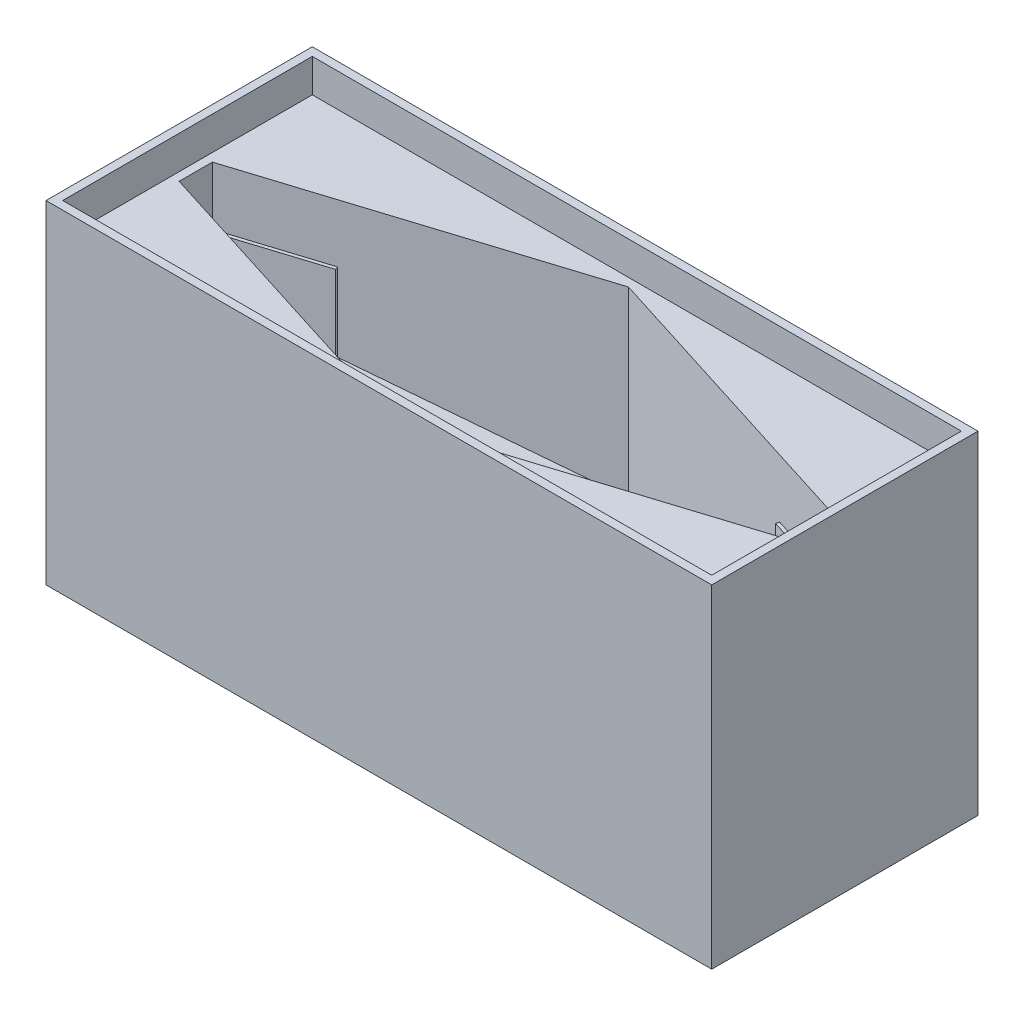
ISO-10303-21;
HEADER;
FILE_DESCRIPTION(('STEP AP214'),'2;1');
FILE_NAME('part.step','',(''),(''),'','','');
FILE_SCHEMA(('AUTOMOTIVE_DESIGN { 1 0 10303 214 1 1 1 1 }'));
ENDSEC;
DATA;
#1=APPLICATION_CONTEXT('core data for automotive mechanical design processes');
#2=APPLICATION_PROTOCOL_DEFINITION('international standard','automotive_design',2000,#1);
#3=PRODUCT_CONTEXT('',#1,'mechanical');
#4=PRODUCT('Part','Part','',(#3));
#5=PRODUCT_RELATED_PRODUCT_CATEGORY('part','',(#4));
#6=PRODUCT_DEFINITION_FORMATION('','',#4);
#7=PRODUCT_DEFINITION_CONTEXT('part definition',#1,'design');
#8=PRODUCT_DEFINITION('design','',#6,#7);
#9=PRODUCT_DEFINITION_SHAPE('','',#8);
#10=(LENGTH_UNIT() NAMED_UNIT(*) SI_UNIT(.MILLI.,.METRE.));
#11=(NAMED_UNIT(*) PLANE_ANGLE_UNIT() SI_UNIT($,.RADIAN.));
#12=(NAMED_UNIT(*) SI_UNIT($,.STERADIAN.) SOLID_ANGLE_UNIT());
#13=UNCERTAINTY_MEASURE_WITH_UNIT(LENGTH_MEASURE(1.E-05),#10,'distance_accuracy_value','');
#14=(GEOMETRIC_REPRESENTATION_CONTEXT(3) GLOBAL_UNCERTAINTY_ASSIGNED_CONTEXT((#13)) GLOBAL_UNIT_ASSIGNED_CONTEXT((#10,
#11,#12)) REPRESENTATION_CONTEXT('',''));
#15=CARTESIAN_POINT('',(0.,0.,0.));
#16=DIRECTION('',(0.,0.,1.));
#17=DIRECTION('',(1.,0.,0.));
#18=AXIS2_PLACEMENT_3D('',#15,#16,#17);
#19=CARTESIAN_POINT('',(0.,7.,3.5));
#20=DIRECTION('',(0.301131367937097,0.,0.953582665134142));
#21=DIRECTION('',(0.953582665134142,0.,-0.301131367937097));
#22=AXIS2_PLACEMENT_3D('',#19,#20,#21);
#23=PLANE('',#22);
#24=DIRECTION('',(0.,1.,0.));
#25=VECTOR('',#24,1.);
#26=CARTESIAN_POINT('',(6.63925200459757,7.25,1.40339410381129));
#27=LINE('',#26,#25);
#28=CARTESIAN_POINT('',(6.63925200459757,4.89773726412581,1.40339410381129));
#29=VERTEX_POINT('',#28);
#30=CARTESIAN_POINT('',(6.63925200459757,7.25,1.40339410381129));
#31=VERTEX_POINT('',#30);
#32=EDGE_CURVE('E879',#29,#31,#27,.T.);
#33=ORIENTED_EDGE('',*,*,#32,.F.);
#34=DIRECTION('',(0.934928879479734,0.196827132522049,-0.295240698783074));
#35=VECTOR('',#34,1.);
#36=CARTESIAN_POINT('',(-5.14285759581207,2.41729313772378,5.12406029341434));
#37=LINE('',#36,#35);
#38=CARTESIAN_POINT('',(0.,3.5,3.5));
#39=VERTEX_POINT('',#38);
#40=EDGE_CURVE('E375',#39,#29,#37,.T.);
#41=ORIENTED_EDGE('',*,*,#40,.F.);
#42=DIRECTION('',(0.,1.,0.));
#43=VECTOR('',#42,1.);
#44=CARTESIAN_POINT('',(0.,7.,3.5));
#45=LINE('',#44,#43);
#46=CARTESIAN_POINT('',(0.,9.,3.5));
#47=VERTEX_POINT('',#46);
#48=EDGE_CURVE('E411',#39,#47,#45,.T.);
#49=ORIENTED_EDGE('',*,*,#48,.T.);
#50=DIRECTION('',(0.953582665134142,0.,-0.301131367937097));
#51=VECTOR('',#50,1.);
#52=CARTESIAN_POINT('',(0.,9.,3.5));
#53=LINE('',#52,#51);
#54=CARTESIAN_POINT('',(9.5,9.,0.5));
#55=VERTEX_POINT('',#54);
#56=EDGE_CURVE('E363',#47,#55,#53,.T.);
#57=ORIENTED_EDGE('',*,*,#56,.T.);
#58=DIRECTION('',(0.,1.,0.));
#59=VECTOR('',#58,1.);
#60=CARTESIAN_POINT('',(9.5,7.,0.5));
#61=LINE('',#60,#59);
#62=CARTESIAN_POINT('',(9.5,7.25,0.5));
#63=VERTEX_POINT('',#62);
#64=EDGE_CURVE('E410',#63,#55,#61,.T.);
#65=ORIENTED_EDGE('',*,*,#64,.F.);
#66=DIRECTION('',(0.953582665134141,0.,-0.301131367937098));
#67=VECTOR('',#66,1.);
#68=CARTESIAN_POINT('',(9.49999999999999,7.25,0.499999999999996));
#69=LINE('',#68,#67);
#70=EDGE_CURVE('E240',#31,#63,#69,.T.);
#71=ORIENTED_EDGE('',*,*,#70,.F.);
#72=EDGE_LOOP('',(#33,#41,#49,#57,#65,#71));
#73=FACE_BOUND('',#72,.T.);
#74=ADVANCED_FACE('F36',(#73),#23,.F.);
#75=CARTESIAN_POINT('',(0.,7.,-3.5));
#76=DIRECTION('',(-0.301131367937098,0.,-0.953582665134142));
#77=DIRECTION('',(-0.953582665134142,0.,0.301131367937098));
#78=AXIS2_PLACEMENT_3D('',#75,#76,#77);
#79=PLANE('',#78);
#80=DIRECTION('',(0.,1.,0.));
#81=VECTOR('',#80,1.);
#82=CARTESIAN_POINT('',(-6.63925200459757,7.25,-1.40339410381129));
#83=LINE('',#82,#81);
#84=CARTESIAN_POINT('',(-6.63925200459757,4.89773726412581,-1.40339410381129));
#85=VERTEX_POINT('',#84);
#86=CARTESIAN_POINT('',(-6.63925200459757,7.25,-1.40339410381129));
#87=VERTEX_POINT('',#86);
#88=EDGE_CURVE('E304',#85,#87,#83,.T.);
#89=ORIENTED_EDGE('',*,*,#88,.F.);
#90=DIRECTION('',(0.934928879479733,-0.196827132522049,-0.295240698783074));
#91=VECTOR('',#90,1.);
#92=CARTESIAN_POINT('',(5.14285759581207,2.41729313772377,-5.12406029341434));
#93=LINE('',#92,#91);
#94=CARTESIAN_POINT('',(0.,3.5,-3.5));
#95=VERTEX_POINT('',#94);
#96=EDGE_CURVE('E393',#85,#95,#93,.T.);
#97=ORIENTED_EDGE('',*,*,#96,.T.);
#98=DIRECTION('',(0.,1.,0.));
#99=VECTOR('',#98,1.);
#100=CARTESIAN_POINT('',(0.,7.,-3.5));
#101=LINE('',#100,#99);
#102=CARTESIAN_POINT('',(0.,9.,-3.5));
#103=VERTEX_POINT('',#102);
#104=EDGE_CURVE('E399',#95,#103,#101,.T.);
#105=ORIENTED_EDGE('',*,*,#104,.T.);
#106=DIRECTION('',(-0.953582665134142,0.,0.301131367937098));
#107=VECTOR('',#106,1.);
#108=CARTESIAN_POINT('',(0.,9.,-3.5));
#109=LINE('',#108,#107);
#110=CARTESIAN_POINT('',(-9.5,9.,-0.499999999999999));
#111=VERTEX_POINT('',#110);
#112=EDGE_CURVE('E372',#103,#111,#109,.T.);
#113=ORIENTED_EDGE('',*,*,#112,.T.);
#114=DIRECTION('',(0.,1.,0.));
#115=VECTOR('',#114,1.);
#116=CARTESIAN_POINT('',(-9.5,7.,-0.499999999999999));
#117=LINE('',#116,#115);
#118=CARTESIAN_POINT('',(-9.5,7.25,-0.499999999999999));
#119=VERTEX_POINT('',#118);
#120=EDGE_CURVE('E398',#119,#111,#117,.T.);
#121=ORIENTED_EDGE('',*,*,#120,.F.);
#122=DIRECTION('',(-0.953582665134142,0.,0.301131367937098));
#123=VECTOR('',#122,1.);
#124=CARTESIAN_POINT('',(-9.49999999999999,7.25,-0.5));
#125=LINE('',#124,#123);
#126=EDGE_CURVE('E309',#87,#119,#125,.T.);
#127=ORIENTED_EDGE('',*,*,#126,.F.);
#128=EDGE_LOOP('',(#89,#97,#105,#113,#121,#127));
#129=FACE_BOUND('',#128,.T.);
#130=ADVANCED_FACE('F481',(#129),#79,.F.);
#131=CARTESIAN_POINT('',(10.,10.,-4.));
#132=DIRECTION('',(-1.,0.,0.));
#133=DIRECTION('',(0.,0.,1.));
#134=AXIS2_PLACEMENT_3D('',#131,#132,#133);
#135=PLANE('',#134);
#136=DIRECTION('',(0.,0.,-1.));
#137=VECTOR('',#136,1.);
#138=CARTESIAN_POINT('',(10.,0.,-4.));
#139=LINE('',#138,#137);
#140=CARTESIAN_POINT('',(10.,0.,4.));
#141=VERTEX_POINT('',#140);
#142=CARTESIAN_POINT('',(10.,0.,-4.));
#143=VERTEX_POINT('',#142);
#144=EDGE_CURVE('E402',#141,#143,#139,.T.);
#145=ORIENTED_EDGE('',*,*,#144,.T.);
#146=DIRECTION('',(0.,-1.,0.));
#147=VECTOR('',#146,1.);
#148=CARTESIAN_POINT('',(10.,10.,-4.));
#149=LINE('',#148,#147);
#150=CARTESIAN_POINT('',(10.,10.,-4.));
#151=VERTEX_POINT('',#150);
#152=EDGE_CURVE('E44',#151,#143,#149,.T.);
#153=ORIENTED_EDGE('',*,*,#152,.F.);
#154=DIRECTION('',(0.,0.,-1.));
#155=VECTOR('',#154,1.);
#156=CARTESIAN_POINT('',(10.,10.,-4.));
#157=LINE('',#156,#155);
#158=CARTESIAN_POINT('',(10.,10.,4.));
#159=VERTEX_POINT('',#158);
#160=EDGE_CURVE('E421',#159,#151,#157,.T.);
#161=ORIENTED_EDGE('',*,*,#160,.F.);
#162=DIRECTION('',(0.,-1.,0.));
#163=VECTOR('',#162,1.);
#164=CARTESIAN_POINT('',(10.,10.,4.));
#165=LINE('',#164,#163);
#166=EDGE_CURVE('E431',#159,#141,#165,.T.);
#167=ORIENTED_EDGE('',*,*,#166,.T.);
#168=EDGE_LOOP('',(#145,#153,#161,#167));
#169=FACE_BOUND('',#168,.T.);
#170=ADVANCED_FACE('F38',(#169),#135,.F.);
#171=CARTESIAN_POINT('',(-10.,10.,-4.));
#172=DIRECTION('',(0.,0.,1.));
#173=DIRECTION('',(1.,0.,0.));
#174=AXIS2_PLACEMENT_3D('',#171,#172,#173);
#175=PLANE('',#174);
#176=DIRECTION('',(-1.,0.,0.));
#177=VECTOR('',#176,1.);
#178=CARTESIAN_POINT('',(-10.,0.,-4.));
#179=LINE('',#178,#177);
#180=CARTESIAN_POINT('',(-10.,0.,-4.));
#181=VERTEX_POINT('',#180);
#182=EDGE_CURVE('E434',#143,#181,#179,.T.);
#183=ORIENTED_EDGE('',*,*,#182,.T.);
#184=DIRECTION('',(0.,-1.,0.));
#185=VECTOR('',#184,1.);
#186=CARTESIAN_POINT('',(-10.,10.,-4.));
#187=LINE('',#186,#185);
#188=CARTESIAN_POINT('',(-10.,10.,-4.));
#189=VERTEX_POINT('',#188);
#190=EDGE_CURVE('E444',#189,#181,#187,.T.);
#191=ORIENTED_EDGE('',*,*,#190,.F.);
#192=DIRECTION('',(-1.,0.,0.));
#193=VECTOR('',#192,1.);
#194=CARTESIAN_POINT('',(-10.,10.,-4.));
#195=LINE('',#194,#193);
#196=EDGE_CURVE('E424',#151,#189,#195,.T.);
#197=ORIENTED_EDGE('',*,*,#196,.F.);
#198=ORIENTED_EDGE('',*,*,#152,.T.);
#199=EDGE_LOOP('',(#183,#191,#197,#198));
#200=FACE_BOUND('',#199,.T.);
#201=ADVANCED_FACE('F449',(#200),#175,.F.);
#202=CARTESIAN_POINT('',(-10.,10.,-4.));
#203=DIRECTION('',(1.,0.,0.));
#204=DIRECTION('',(0.,0.,-1.));
#205=AXIS2_PLACEMENT_3D('',#202,#203,#204);
#206=PLANE('',#205);
#207=DIRECTION('',(0.,0.,1.));
#208=VECTOR('',#207,1.);
#209=CARTESIAN_POINT('',(-10.,0.,-4.));
#210=LINE('',#209,#208);
#211=CARTESIAN_POINT('',(-10.,0.,4.));
#212=VERTEX_POINT('',#211);
#213=EDGE_CURVE('E436',#181,#212,#210,.T.);
#214=ORIENTED_EDGE('',*,*,#213,.T.);
#215=DIRECTION('',(0.,-1.,0.));
#216=VECTOR('',#215,1.);
#217=CARTESIAN_POINT('',(-10.,10.,4.));
#218=LINE('',#217,#216);
#219=CARTESIAN_POINT('',(-10.,10.,4.));
#220=VERTEX_POINT('',#219);
#221=EDGE_CURVE('E441',#220,#212,#218,.T.);
#222=ORIENTED_EDGE('',*,*,#221,.F.);
#223=DIRECTION('',(0.,0.,1.));
#224=VECTOR('',#223,1.);
#225=CARTESIAN_POINT('',(-10.,10.,-4.));
#226=LINE('',#225,#224);
#227=EDGE_CURVE('E427',#189,#220,#226,.T.);
#228=ORIENTED_EDGE('',*,*,#227,.F.);
#229=ORIENTED_EDGE('',*,*,#190,.T.);
#230=EDGE_LOOP('',(#214,#222,#228,#229));
#231=FACE_BOUND('',#230,.T.);
#232=ADVANCED_FACE('F461',(#231),#206,.F.);
#233=CARTESIAN_POINT('',(-10.,10.,4.));
#234=DIRECTION('',(0.,0.,-1.));
#235=DIRECTION('',(-1.,0.,0.));
#236=AXIS2_PLACEMENT_3D('',#233,#234,#235);
#237=PLANE('',#236);
#238=DIRECTION('',(1.,0.,0.));
#239=VECTOR('',#238,1.);
#240=CARTESIAN_POINT('',(-10.,0.,4.));
#241=LINE('',#240,#239);
#242=EDGE_CURVE('E425',#212,#141,#241,.T.);
#243=ORIENTED_EDGE('',*,*,#242,.T.);
#244=ORIENTED_EDGE('',*,*,#166,.F.);
#245=DIRECTION('',(1.,0.,0.));
#246=VECTOR('',#245,1.);
#247=CARTESIAN_POINT('',(-10.,10.,4.));
#248=LINE('',#247,#246);
#249=EDGE_CURVE('E429',#220,#159,#248,.T.);
#250=ORIENTED_EDGE('',*,*,#249,.F.);
#251=ORIENTED_EDGE('',*,*,#221,.T.);
#252=EDGE_LOOP('',(#243,#244,#250,#251));
#253=FACE_BOUND('',#252,.T.);
#254=ADVANCED_FACE('F465',(#253),#237,.F.);
#255=CARTESIAN_POINT('',(10.,10.,4.));
#256=DIRECTION('',(0.,1.,0.));
#257=DIRECTION('',(0.,0.,1.));
#258=AXIS2_PLACEMENT_3D('',#255,#256,#257);
#259=PLANE('',#258);
#260=DIRECTION('',(0.,0.,-1.));
#261=VECTOR('',#260,1.);
#262=CARTESIAN_POINT('',(9.75,10.,3.75));
#263=LINE('',#262,#261);
#264=CARTESIAN_POINT('',(9.75,10.,3.75));
#265=VERTEX_POINT('',#264);
#266=CARTESIAN_POINT('',(9.75,10.,-3.75));
#267=VERTEX_POINT('',#266);
#268=EDGE_CURVE('E328',#265,#267,#263,.T.);
#269=ORIENTED_EDGE('',*,*,#268,.F.);
#270=DIRECTION('',(1.,0.,0.));
#271=VECTOR('',#270,1.);
#272=CARTESIAN_POINT('',(-9.75,10.,3.75));
#273=LINE('',#272,#271);
#274=CARTESIAN_POINT('',(-9.75,10.,3.75));
#275=VERTEX_POINT('',#274);
#276=EDGE_CURVE('E333',#275,#265,#273,.T.);
#277=ORIENTED_EDGE('',*,*,#276,.F.);
#278=DIRECTION('',(0.,0.,1.));
#279=VECTOR('',#278,1.);
#280=CARTESIAN_POINT('',(-9.75,10.,3.75));
#281=LINE('',#280,#279);
#282=CARTESIAN_POINT('',(-9.75,10.,-3.75));
#283=VERTEX_POINT('',#282);
#284=EDGE_CURVE('E347',#283,#275,#281,.T.);
#285=ORIENTED_EDGE('',*,*,#284,.F.);
#286=DIRECTION('',(-1.,0.,0.));
#287=VECTOR('',#286,1.);
#288=CARTESIAN_POINT('',(-9.75,10.,-3.75));
#289=LINE('',#288,#287);
#290=EDGE_CURVE('E344',#267,#283,#289,.T.);
#291=ORIENTED_EDGE('',*,*,#290,.F.);
#292=EDGE_LOOP('',(#269,#277,#285,#291));
#293=FACE_BOUND('',#292,.T.);
#294=ORIENTED_EDGE('',*,*,#160,.T.);
#295=ORIENTED_EDGE('',*,*,#196,.T.);
#296=ORIENTED_EDGE('',*,*,#227,.T.);
#297=ORIENTED_EDGE('',*,*,#249,.T.);
#298=EDGE_LOOP('',(#294,#295,#296,#297));
#299=FACE_BOUND('',#298,.T.);
#300=ADVANCED_FACE('F467',(#293,#299),#259,.T.);
#301=CARTESIAN_POINT('',(10.,0.,4.));
#302=DIRECTION('',(0.,1.,0.));
#303=DIRECTION('',(0.,0.,1.));
#304=AXIS2_PLACEMENT_3D('',#301,#302,#303);
#305=PLANE('',#304);
#306=ORIENTED_EDGE('',*,*,#144,.F.);
#307=ORIENTED_EDGE('',*,*,#242,.F.);
#308=ORIENTED_EDGE('',*,*,#213,.F.);
#309=ORIENTED_EDGE('',*,*,#182,.F.);
#310=EDGE_LOOP('',(#306,#307,#308,#309));
#311=FACE_BOUND('',#310,.T.);
#312=ADVANCED_FACE('F457',(#311),#305,.F.);
#313=CARTESIAN_POINT('',(9.75,9.,-3.75));
#314=DIRECTION('',(0.,-1.,0.));
#315=DIRECTION('',(0.,0.,-1.));
#316=AXIS2_PLACEMENT_3D('',#313,#314,#315);
#317=PLANE('',#316);
#318=DIRECTION('',(0.,0.,-1.));
#319=VECTOR('',#318,1.);
#320=CARTESIAN_POINT('',(9.75,9.,3.75));
#321=LINE('',#320,#319);
#322=CARTESIAN_POINT('',(9.75,9.,3.75));
#323=VERTEX_POINT('',#322);
#324=CARTESIAN_POINT('',(9.75,9.,-3.75));
#325=VERTEX_POINT('',#324);
#326=EDGE_CURVE('E329',#323,#325,#321,.T.);
#327=ORIENTED_EDGE('',*,*,#326,.T.);
#328=DIRECTION('',(-1.,0.,0.));
#329=VECTOR('',#328,1.);
#330=CARTESIAN_POINT('',(-9.75,9.,-3.75));
#331=LINE('',#330,#329);
#332=CARTESIAN_POINT('',(-9.75,9.,-3.75));
#333=VERTEX_POINT('',#332);
#334=EDGE_CURVE('E332',#325,#333,#331,.T.);
#335=ORIENTED_EDGE('',*,*,#334,.T.);
#336=DIRECTION('',(0.,0.,1.));
#337=VECTOR('',#336,1.);
#338=CARTESIAN_POINT('',(-9.75,9.,3.75));
#339=LINE('',#338,#337);
#340=CARTESIAN_POINT('',(-9.75,9.,3.75));
#341=VERTEX_POINT('',#340);
#342=EDGE_CURVE('E336',#333,#341,#339,.T.);
#343=ORIENTED_EDGE('',*,*,#342,.T.);
#344=DIRECTION('',(1.,0.,0.));
#345=VECTOR('',#344,1.);
#346=CARTESIAN_POINT('',(-9.75,9.,3.75));
#347=LINE('',#346,#345);
#348=EDGE_CURVE('E339',#341,#323,#347,.T.);
#349=ORIENTED_EDGE('',*,*,#348,.T.);
#350=EDGE_LOOP('',(#327,#335,#343,#349));
#351=FACE_BOUND('',#350,.T.);
#352=DIRECTION('',(-0.953582665134142,0.,-0.301131367937097));
#353=VECTOR('',#352,1.);
#354=CARTESIAN_POINT('',(9.5,9.,-0.5));
#355=LINE('',#354,#353);
#356=CARTESIAN_POINT('',(9.5,9.,-0.500000000000004));
#357=VERTEX_POINT('',#356);
#358=EDGE_CURVE('E369',#357,#103,#355,.T.);
#359=ORIENTED_EDGE('',*,*,#358,.F.);
#360=DIRECTION('',(0.,0.,-1.));
#361=VECTOR('',#360,1.);
#362=CARTESIAN_POINT('',(9.5,9.,0.5));
#363=LINE('',#362,#361);
#364=EDGE_CURVE('E366',#55,#357,#363,.T.);
#365=ORIENTED_EDGE('',*,*,#364,.F.);
#366=ORIENTED_EDGE('',*,*,#56,.F.);
#367=DIRECTION('',(0.953582665134142,0.,0.301131367937097));
#368=VECTOR('',#367,1.);
#369=CARTESIAN_POINT('',(-9.5,9.,0.500000000000001));
#370=LINE('',#369,#368);
#371=CARTESIAN_POINT('',(-9.5,9.,0.500000000000001));
#372=VERTEX_POINT('',#371);
#373=EDGE_CURVE('E354',#372,#47,#370,.T.);
#374=ORIENTED_EDGE('',*,*,#373,.F.);
#375=DIRECTION('',(0.,0.,1.));
#376=VECTOR('',#375,1.);
#377=CARTESIAN_POINT('',(-9.5,9.,-0.499999999999999));
#378=LINE('',#377,#376);
#379=EDGE_CURVE('E11',#111,#372,#378,.T.);
#380=ORIENTED_EDGE('',*,*,#379,.F.);
#381=ORIENTED_EDGE('',*,*,#112,.F.);
#382=EDGE_LOOP('',(#359,#365,#366,#374,#380,#381));
#383=FACE_BOUND('',#382,.T.);
#384=ADVANCED_FACE('F475',(#351,#383),#317,.F.);
#385=CARTESIAN_POINT('',(9.75,9.,3.75));
#386=DIRECTION('',(1.,0.,0.));
#387=DIRECTION('',(0.,0.,-1.));
#388=AXIS2_PLACEMENT_3D('',#385,#386,#387);
#389=PLANE('',#388);
#390=ORIENTED_EDGE('',*,*,#268,.T.);
#391=DIRECTION('',(0.,1.,0.));
#392=VECTOR('',#391,1.);
#393=CARTESIAN_POINT('',(9.75,9.,-3.75));
#394=LINE('',#393,#392);
#395=EDGE_CURVE('E342',#325,#267,#394,.T.);
#396=ORIENTED_EDGE('',*,*,#395,.F.);
#397=ORIENTED_EDGE('',*,*,#326,.F.);
#398=DIRECTION('',(0.,1.,0.));
#399=VECTOR('',#398,1.);
#400=CARTESIAN_POINT('',(9.75,9.,3.75));
#401=LINE('',#400,#399);
#402=EDGE_CURVE('E352',#323,#265,#401,.T.);
#403=ORIENTED_EDGE('',*,*,#402,.T.);
#404=EDGE_LOOP('',(#390,#396,#397,#403));
#405=FACE_BOUND('',#404,.T.);
#406=ADVANCED_FACE('F604',(#405),#389,.F.);
#407=CARTESIAN_POINT('',(-9.75,9.,3.75));
#408=DIRECTION('',(0.,0.,1.));
#409=DIRECTION('',(1.,0.,0.));
#410=AXIS2_PLACEMENT_3D('',#407,#408,#409);
#411=PLANE('',#410);
#412=ORIENTED_EDGE('',*,*,#276,.T.);
#413=ORIENTED_EDGE('',*,*,#402,.F.);
#414=ORIENTED_EDGE('',*,*,#348,.F.);
#415=DIRECTION('',(0.,1.,0.));
#416=VECTOR('',#415,1.);
#417=CARTESIAN_POINT('',(-9.75,9.,3.75));
#418=LINE('',#417,#416);
#419=EDGE_CURVE('E355',#341,#275,#418,.T.);
#420=ORIENTED_EDGE('',*,*,#419,.T.);
#421=EDGE_LOOP('',(#412,#413,#414,#420));
#422=FACE_BOUND('',#421,.T.);
#423=ADVANCED_FACE('F606',(#422),#411,.F.);
#424=CARTESIAN_POINT('',(-9.75,9.,3.75));
#425=DIRECTION('',(-1.,0.,0.));
#426=DIRECTION('',(0.,0.,1.));
#427=AXIS2_PLACEMENT_3D('',#424,#425,#426);
#428=PLANE('',#427);
#429=ORIENTED_EDGE('',*,*,#284,.T.);
#430=ORIENTED_EDGE('',*,*,#419,.F.);
#431=ORIENTED_EDGE('',*,*,#342,.F.);
#432=DIRECTION('',(0.,1.,0.));
#433=VECTOR('',#432,1.);
#434=CARTESIAN_POINT('',(-9.75,9.,-3.75));
#435=LINE('',#434,#433);
#436=EDGE_CURVE('E357',#333,#283,#435,.T.);
#437=ORIENTED_EDGE('',*,*,#436,.T.);
#438=EDGE_LOOP('',(#429,#430,#431,#437));
#439=FACE_BOUND('',#438,.T.);
#440=ADVANCED_FACE('F609',(#439),#428,.F.);
#441=CARTESIAN_POINT('',(-9.75,9.,-3.75));
#442=DIRECTION('',(0.,0.,-1.));
#443=DIRECTION('',(-1.,0.,0.));
#444=AXIS2_PLACEMENT_3D('',#441,#442,#443);
#445=PLANE('',#444);
#446=ORIENTED_EDGE('',*,*,#290,.T.);
#447=ORIENTED_EDGE('',*,*,#436,.F.);
#448=ORIENTED_EDGE('',*,*,#334,.F.);
#449=ORIENTED_EDGE('',*,*,#395,.T.);
#450=EDGE_LOOP('',(#446,#447,#448,#449));
#451=FACE_BOUND('',#450,.T.);
#452=ADVANCED_FACE('F613',(#451),#445,.F.);
#453=CARTESIAN_POINT('',(-2.52207922366911,2.96903595291177,-13.791020348659));
#454=DIRECTION('',(0.206010481049842,-0.978549784986749,0.));
#455=DIRECTION('',(0.978549784986749,0.206010481049842,0.));
#456=AXIS2_PLACEMENT_3D('',#453,#454,#455);
#457=PLANE('',#456);
#458=DIRECTION('',(0.,0.,1.));
#459=VECTOR('',#458,1.);
#460=CARTESIAN_POINT('',(0.,3.5,-13.791020348659));
#461=LINE('',#460,#459);
#462=EDGE_CURVE('E392',#95,#39,#461,.T.);
#463=ORIENTED_EDGE('',*,*,#462,.T.);
#464=ORIENTED_EDGE('',*,*,#40,.T.);
#465=DIRECTION('',(-0.934928879479733,-0.196827132522049,0.295240698783074));
#466=VECTOR('',#465,1.);
#467=CARTESIAN_POINT('',(6.63925200459757,4.89773726412581,1.40339410381129));
#468=LINE('',#467,#466);
#469=CARTESIAN_POINT('',(9.49999999999999,5.5,0.499999999999996));
#470=VERTEX_POINT('',#469);
#471=EDGE_CURVE('E244',#470,#29,#468,.T.);
#472=ORIENTED_EDGE('',*,*,#471,.F.);
#473=DIRECTION('',(0.,0.,1.));
#474=VECTOR('',#473,1.);
#475=CARTESIAN_POINT('',(9.5,5.5,-13.791020348659));
#476=LINE('',#475,#474);
#477=CARTESIAN_POINT('',(9.49999999999999,5.5,-0.500000000000005));
#478=VERTEX_POINT('',#477);
#479=EDGE_CURVE('E381',#478,#470,#476,.T.);
#480=ORIENTED_EDGE('',*,*,#479,.F.);
#481=DIRECTION('',(-0.934928879479733,-0.196827132522049,-0.295240698783074));
#482=VECTOR('',#481,1.);
#483=CARTESIAN_POINT('',(6.63925200459757,4.89773726412581,-1.4033941038113));
#484=LINE('',#483,#482);
#485=CARTESIAN_POINT('',(6.63925200459757,4.89773726412581,-1.4033941038113));
#486=VERTEX_POINT('',#485);
#487=EDGE_CURVE('E246',#478,#486,#484,.T.);
#488=ORIENTED_EDGE('',*,*,#487,.T.);
#489=DIRECTION('',(0.934928879479734,0.196827132522049,0.295240698783074));
#490=VECTOR('',#489,1.);
#491=CARTESIAN_POINT('',(-5.14285759581207,2.41729313772378,-5.12406029341434));
#492=LINE('',#491,#490);
#493=EDGE_CURVE('E378',#95,#486,#492,.T.);
#494=ORIENTED_EDGE('',*,*,#493,.F.);
#495=EDGE_LOOP('',(#463,#464,#472,#480,#488,#494));
#496=FACE_BOUND('',#495,.T.);
#497=ADVANCED_FACE('F503',(#496),#457,.F.);
#498=CARTESIAN_POINT('',(2.52207922366912,2.96903595291177,-13.791020348659));
#499=DIRECTION('',(-0.206010481049842,-0.978549784986749,0.));
#500=DIRECTION('',(0.978549784986749,-0.206010481049842,0.));
#501=AXIS2_PLACEMENT_3D('',#498,#499,#500);
#502=PLANE('',#501);
#503=DIRECTION('',(0.,0.,1.));
#504=VECTOR('',#503,1.);
#505=CARTESIAN_POINT('',(-9.5,5.5,-13.791020348659));
#506=LINE('',#505,#504);
#507=CARTESIAN_POINT('',(-9.49999999999999,5.5,-0.5));
#508=VERTEX_POINT('',#507);
#509=CARTESIAN_POINT('',(-9.49999999999999,5.5,0.5));
#510=VERTEX_POINT('',#509);
#511=EDGE_CURVE('E388',#508,#510,#506,.T.);
#512=ORIENTED_EDGE('',*,*,#511,.T.);
#513=DIRECTION('',(0.934928879479734,-0.196827132522049,0.295240698783074));
#514=VECTOR('',#513,1.);
#515=CARTESIAN_POINT('',(5.14285759581207,2.41729313772377,5.12406029341433));
#516=LINE('',#515,#514);
#517=CARTESIAN_POINT('',(-6.63925200459757,4.89773726412581,1.40339410381129));
#518=VERTEX_POINT('',#517);
#519=EDGE_CURVE('E385',#510,#518,#516,.T.);
#520=ORIENTED_EDGE('',*,*,#519,.T.);
#521=EDGE_CURVE('E384',#518,#39,#516,.T.);
#522=ORIENTED_EDGE('',*,*,#521,.T.);
#523=ORIENTED_EDGE('',*,*,#462,.F.);
#524=ORIENTED_EDGE('',*,*,#96,.F.);
#525=EDGE_CURVE('E389',#508,#85,#93,.T.);
#526=ORIENTED_EDGE('',*,*,#525,.F.);
#527=EDGE_LOOP('',(#512,#520,#522,#523,#524,#526));
#528=FACE_BOUND('',#527,.T.);
#529=ADVANCED_FACE('F498',(#528),#502,.F.);
#530=CARTESIAN_POINT('',(-9.5,7.,-0.499999999999999));
#531=DIRECTION('',(-1.,0.,0.));
#532=DIRECTION('',(0.,0.,1.));
#533=AXIS2_PLACEMENT_3D('',#530,#531,#532);
#534=PLANE('',#533);
#535=EDGE_CURVE('E418',#508,#119,#117,.T.);
#536=ORIENTED_EDGE('',*,*,#535,.T.);
#537=ORIENTED_EDGE('',*,*,#120,.T.);
#538=ORIENTED_EDGE('',*,*,#379,.T.);
#539=DIRECTION('',(0.,1.,0.));
#540=VECTOR('',#539,1.);
#541=CARTESIAN_POINT('',(-9.5,7.,0.500000000000001));
#542=LINE('',#541,#540);
#543=CARTESIAN_POINT('',(-9.49999999999999,7.25,0.5));
#544=VERTEX_POINT('',#543);
#545=EDGE_CURVE('E417',#544,#372,#542,.T.);
#546=ORIENTED_EDGE('',*,*,#545,.F.);
#547=EDGE_CURVE('E414',#510,#544,#542,.T.);
#548=ORIENTED_EDGE('',*,*,#547,.F.);
#549=ORIENTED_EDGE('',*,*,#511,.F.);
#550=EDGE_LOOP('',(#536,#537,#538,#546,#548,#549));
#551=FACE_BOUND('',#550,.T.);
#552=ADVANCED_FACE('F495',(#551),#534,.F.);
#553=CARTESIAN_POINT('',(-9.5,7.,0.500000000000001));
#554=DIRECTION('',(-0.301131367937097,0.,0.953582665134142));
#555=DIRECTION('',(0.953582665134142,0.,0.301131367937097));
#556=AXIS2_PLACEMENT_3D('',#553,#554,#555);
#557=PLANE('',#556);
#558=DIRECTION('',(0.,1.,0.));
#559=VECTOR('',#558,1.);
#560=CARTESIAN_POINT('',(-6.63925200459757,7.25,1.40339410381129));
#561=LINE('',#560,#559);
#562=CARTESIAN_POINT('',(-6.63925200459757,7.25,1.40339410381129));
#563=VERTEX_POINT('',#562);
#564=EDGE_CURVE('E282',#518,#563,#561,.T.);
#565=ORIENTED_EDGE('',*,*,#564,.T.);
#566=DIRECTION('',(-0.953582665134142,0.,-0.301131367937098));
#567=VECTOR('',#566,1.);
#568=CARTESIAN_POINT('',(-9.49999999999999,7.25,0.5));
#569=LINE('',#568,#567);
#570=EDGE_CURVE('E277',#563,#544,#569,.T.);
#571=ORIENTED_EDGE('',*,*,#570,.T.);
#572=ORIENTED_EDGE('',*,*,#545,.T.);
#573=ORIENTED_EDGE('',*,*,#373,.T.);
#574=ORIENTED_EDGE('',*,*,#48,.F.);
#575=ORIENTED_EDGE('',*,*,#521,.F.);
#576=EDGE_LOOP('',(#565,#571,#572,#573,#574,#575));
#577=FACE_BOUND('',#576,.T.);
#578=ADVANCED_FACE('F492',(#577),#557,.F.);
#579=CARTESIAN_POINT('',(9.5,7.,0.5));
#580=DIRECTION('',(1.,0.,0.));
#581=DIRECTION('',(0.,0.,-1.));
#582=AXIS2_PLACEMENT_3D('',#579,#580,#581);
#583=PLANE('',#582);
#584=EDGE_CURVE('E407',#470,#63,#61,.T.);
#585=ORIENTED_EDGE('',*,*,#584,.T.);
#586=ORIENTED_EDGE('',*,*,#64,.T.);
#587=ORIENTED_EDGE('',*,*,#364,.T.);
#588=DIRECTION('',(0.,1.,0.));
#589=VECTOR('',#588,1.);
#590=CARTESIAN_POINT('',(9.5,7.,-0.5));
#591=LINE('',#590,#589);
#592=CARTESIAN_POINT('',(9.49999999999999,7.25,-0.500000000000005));
#593=VERTEX_POINT('',#592);
#594=EDGE_CURVE('E406',#593,#357,#591,.T.);
#595=ORIENTED_EDGE('',*,*,#594,.F.);
#596=EDGE_CURVE('E403',#478,#593,#591,.T.);
#597=ORIENTED_EDGE('',*,*,#596,.F.);
#598=ORIENTED_EDGE('',*,*,#479,.T.);
#599=EDGE_LOOP('',(#585,#586,#587,#595,#597,#598));
#600=FACE_BOUND('',#599,.T.);
#601=ADVANCED_FACE('F490',(#600),#583,.F.);
#602=CARTESIAN_POINT('',(9.5,7.,-0.5));
#603=DIRECTION('',(0.301131367937097,0.,-0.953582665134142));
#604=DIRECTION('',(-0.953582665134142,0.,-0.301131367937097));
#605=AXIS2_PLACEMENT_3D('',#602,#603,#604);
#606=PLANE('',#605);
#607=DIRECTION('',(0.,1.,0.));
#608=VECTOR('',#607,1.);
#609=CARTESIAN_POINT('',(6.63925200459757,7.25,-1.4033941038113));
#610=LINE('',#609,#608);
#611=CARTESIAN_POINT('',(6.63925200459757,7.25,-1.40339410381129));
#612=VERTEX_POINT('',#611);
#613=EDGE_CURVE('E257',#486,#612,#610,.T.);
#614=ORIENTED_EDGE('',*,*,#613,.T.);
#615=DIRECTION('',(0.953582665134142,0.,0.301131367937097));
#616=VECTOR('',#615,1.);
#617=CARTESIAN_POINT('',(9.49999999999999,7.25,-0.500000000000005));
#618=LINE('',#617,#616);
#619=EDGE_CURVE('E59',#612,#593,#618,.T.);
#620=ORIENTED_EDGE('',*,*,#619,.T.);
#621=ORIENTED_EDGE('',*,*,#594,.T.);
#622=ORIENTED_EDGE('',*,*,#358,.T.);
#623=ORIENTED_EDGE('',*,*,#104,.F.);
#624=ORIENTED_EDGE('',*,*,#493,.T.);
#625=EDGE_LOOP('',(#614,#620,#621,#622,#623,#624));
#626=FACE_BOUND('',#625,.T.);
#627=ADVANCED_FACE('F527',(#626),#606,.F.);
#628=CARTESIAN_POINT('',(-6.60913886780386,4.89773726412581,-1.30803583729788));
#629=DIRECTION('',(0.187690941601087,0.980438208100412,-0.0592708236635011));
#630=DIRECTION('',(-0.982164913594192,0.188021494793851,0.));
#631=AXIS2_PLACEMENT_3D('',#628,#629,#630);
#632=PLANE('',#631);
#633=ORIENTED_EDGE('',*,*,#525,.T.);
#634=DIRECTION('',(-0.301131367937098,0.,-0.953582665134141));
#635=VECTOR('',#634,1.);
#636=CARTESIAN_POINT('',(-6.60913886780386,4.89773726412581,-1.30803583729788));
#637=LINE('',#636,#635);
#638=CARTESIAN_POINT('',(-6.60913886780386,4.89773726412581,-1.30803583729788));
#639=VERTEX_POINT('',#638);
#640=EDGE_CURVE('E326',#639,#85,#637,.T.);
#641=ORIENTED_EDGE('',*,*,#640,.F.);
#642=DIRECTION('',(0.934928879479733,-0.196827132522049,-0.295240698783074));
#643=VECTOR('',#642,1.);
#644=CARTESIAN_POINT('',(-6.60913886780386,4.89773726412581,-1.30803583729788));
#645=LINE('',#644,#643);
#646=CARTESIAN_POINT('',(-9.46988686320628,5.5,-0.404641733486586));
#647=VERTEX_POINT('',#646);
#648=EDGE_CURVE('E305',#647,#639,#645,.T.);
#649=ORIENTED_EDGE('',*,*,#648,.F.);
#650=DIRECTION('',(-0.301131367937098,0.,-0.953582665134141));
#651=VECTOR('',#650,1.);
#652=CARTESIAN_POINT('',(-9.46988686320628,5.5,-0.404641733486586));
#653=LINE('',#652,#651);
#654=EDGE_CURVE('E315',#647,#508,#653,.T.);
#655=ORIENTED_EDGE('',*,*,#654,.T.);
#656=EDGE_LOOP('',(#633,#641,#649,#655));
#657=FACE_BOUND('',#656,.T.);
#658=ADVANCED_FACE('F518',(#657),#632,.F.);
#659=CARTESIAN_POINT('',(-6.60913886780386,7.25,-1.30803583729788));
#660=DIRECTION('',(-0.953582665134141,0.,0.301131367937098));
#661=DIRECTION('',(0.301131367937098,0.,0.953582665134142));
#662=AXIS2_PLACEMENT_3D('',#659,#660,#661);
#663=PLANE('',#662);
#664=ORIENTED_EDGE('',*,*,#88,.T.);
#665=DIRECTION('',(-0.301131367937098,0.,-0.953582665134141));
#666=VECTOR('',#665,1.);
#667=CARTESIAN_POINT('',(-6.60913886780386,7.25,-1.30803583729788));
#668=LINE('',#667,#666);
#669=CARTESIAN_POINT('',(-6.60913886780386,7.25,-1.30803583729788));
#670=VERTEX_POINT('',#669);
#671=EDGE_CURVE('E323',#670,#87,#668,.T.);
#672=ORIENTED_EDGE('',*,*,#671,.F.);
#673=DIRECTION('',(0.,1.,0.));
#674=VECTOR('',#673,1.);
#675=CARTESIAN_POINT('',(-6.60913886780386,7.25,-1.30803583729788));
#676=LINE('',#675,#674);
#677=EDGE_CURVE('E308',#639,#670,#676,.T.);
#678=ORIENTED_EDGE('',*,*,#677,.F.);
#679=ORIENTED_EDGE('',*,*,#640,.T.);
#680=EDGE_LOOP('',(#664,#672,#678,#679));
#681=FACE_BOUND('',#680,.T.);
#682=ADVANCED_FACE('F595',(#681),#663,.F.);
#683=CARTESIAN_POINT('',(-9.46988686320628,7.25,-0.404641733486586));
#684=DIRECTION('',(0.,-1.,0.));
#685=DIRECTION('',(1.,0.,0.));
#686=AXIS2_PLACEMENT_3D('',#683,#684,#685);
#687=PLANE('',#686);
#688=ORIENTED_EDGE('',*,*,#126,.T.);
#689=DIRECTION('',(-0.301131367937098,0.,-0.953582665134141));
#690=VECTOR('',#689,1.);
#691=CARTESIAN_POINT('',(-9.46988686320628,7.25,-0.404641733486586));
#692=LINE('',#691,#690);
#693=CARTESIAN_POINT('',(-9.46988686320628,7.25,-0.404641733486586));
#694=VERTEX_POINT('',#693);
#695=EDGE_CURVE('E321',#694,#119,#692,.T.);
#696=ORIENTED_EDGE('',*,*,#695,.F.);
#697=DIRECTION('',(-0.953582665134142,0.,0.301131367937098));
#698=VECTOR('',#697,1.);
#699=CARTESIAN_POINT('',(-9.46988686320628,7.25,-0.404641733486586));
#700=LINE('',#699,#698);
#701=EDGE_CURVE('E311',#670,#694,#700,.T.);
#702=ORIENTED_EDGE('',*,*,#701,.F.);
#703=ORIENTED_EDGE('',*,*,#671,.T.);
#704=EDGE_LOOP('',(#688,#696,#702,#703));
#705=FACE_BOUND('',#704,.T.);
#706=ADVANCED_FACE('F592',(#705),#687,.F.);
#707=CARTESIAN_POINT('',(-9.46988686320628,5.5,-0.404641733486586));
#708=DIRECTION('',(0.953582665134141,0.,-0.301131367937098));
#709=DIRECTION('',(-0.301131367937098,0.,-0.953582665134142));
#710=AXIS2_PLACEMENT_3D('',#707,#708,#709);
#711=PLANE('',#710);
#712=ORIENTED_EDGE('',*,*,#535,.F.);
#713=ORIENTED_EDGE('',*,*,#654,.F.);
#714=DIRECTION('',(0.,-1.,0.));
#715=VECTOR('',#714,1.);
#716=CARTESIAN_POINT('',(-9.46988686320628,5.5,-0.404641733486586));
#717=LINE('',#716,#715);
#718=EDGE_CURVE('E313',#694,#647,#717,.T.);
#719=ORIENTED_EDGE('',*,*,#718,.F.);
#720=ORIENTED_EDGE('',*,*,#695,.T.);
#721=EDGE_LOOP('',(#712,#713,#719,#720));
#722=FACE_BOUND('',#721,.T.);
#723=ADVANCED_FACE('F512',(#722),#711,.F.);
#724=CARTESIAN_POINT('',(-9.46988686320628,5.5,-0.404641733486586));
#725=DIRECTION('',(-0.301131367937098,0.,-0.953582665134141));
#726=DIRECTION('',(-0.953582665134142,0.,0.301131367937098));
#727=AXIS2_PLACEMENT_3D('',#724,#725,#726);
#728=PLANE('',#727);
#729=ORIENTED_EDGE('',*,*,#648,.T.);
#730=ORIENTED_EDGE('',*,*,#677,.T.);
#731=ORIENTED_EDGE('',*,*,#701,.T.);
#732=ORIENTED_EDGE('',*,*,#718,.T.);
#733=EDGE_LOOP('',(#729,#730,#731,#732));
#734=FACE_BOUND('',#733,.T.);
#735=ADVANCED_FACE('F585',(#734),#728,.F.);
#736=CARTESIAN_POINT('',(-6.60913886780386,4.89773726412581,1.30803583729788));
#737=DIRECTION('',(-0.187690941601087,-0.980438208100412,-0.0592708236635011));
#738=DIRECTION('',(0.982164913594192,-0.188021494793851,0.));
#739=AXIS2_PLACEMENT_3D('',#736,#737,#738);
#740=PLANE('',#739);
#741=ORIENTED_EDGE('',*,*,#519,.F.);
#742=DIRECTION('',(-0.301131367937098,0.,0.953582665134141));
#743=VECTOR('',#742,1.);
#744=CARTESIAN_POINT('',(-9.46988686320628,5.5,0.404641733486586));
#745=LINE('',#744,#743);
#746=CARTESIAN_POINT('',(-9.46988686320628,5.5,0.404641733486586));
#747=VERTEX_POINT('',#746);
#748=EDGE_CURVE('E302',#747,#510,#745,.T.);
#749=ORIENTED_EDGE('',*,*,#748,.F.);
#750=DIRECTION('',(0.934928879479733,-0.196827132522049,0.295240698783074));
#751=VECTOR('',#750,1.);
#752=CARTESIAN_POINT('',(-6.60913886780386,4.89773726412581,1.30803583729788));
#753=LINE('',#752,#751);
#754=CARTESIAN_POINT('',(-6.60913886780386,4.89773726412581,1.30803583729788));
#755=VERTEX_POINT('',#754);
#756=EDGE_CURVE('E278',#747,#755,#753,.T.);
#757=ORIENTED_EDGE('',*,*,#756,.T.);
#758=DIRECTION('',(-0.301131367937098,0.,0.953582665134141));
#759=VECTOR('',#758,1.);
#760=CARTESIAN_POINT('',(-6.60913886780386,4.89773726412581,1.30803583729788));
#761=LINE('',#760,#759);
#762=EDGE_CURVE('E291',#755,#518,#761,.T.);
#763=ORIENTED_EDGE('',*,*,#762,.T.);
#764=EDGE_LOOP('',(#741,#749,#757,#763));
#765=FACE_BOUND('',#764,.T.);
#766=ADVANCED_FACE('F581',(#765),#740,.T.);
#767=CARTESIAN_POINT('',(-9.46988686320628,5.5,0.404641733486586));
#768=DIRECTION('',(-0.953582665134141,0.,-0.301131367937098));
#769=DIRECTION('',(-0.301131367937098,0.,0.953582665134142));
#770=AXIS2_PLACEMENT_3D('',#767,#768,#769);
#771=PLANE('',#770);
#772=ORIENTED_EDGE('',*,*,#547,.T.);
#773=DIRECTION('',(-0.301131367937098,0.,0.953582665134141));
#774=VECTOR('',#773,1.);
#775=CARTESIAN_POINT('',(-9.46988686320628,7.25,0.404641733486586));
#776=LINE('',#775,#774);
#777=CARTESIAN_POINT('',(-9.46988686320628,7.25,0.404641733486586));
#778=VERTEX_POINT('',#777);
#779=EDGE_CURVE('E300',#778,#544,#776,.T.);
#780=ORIENTED_EDGE('',*,*,#779,.F.);
#781=DIRECTION('',(0.,-1.,0.));
#782=VECTOR('',#781,1.);
#783=CARTESIAN_POINT('',(-9.46988686320628,5.5,0.404641733486586));
#784=LINE('',#783,#782);
#785=EDGE_CURVE('E281',#778,#747,#784,.T.);
#786=ORIENTED_EDGE('',*,*,#785,.T.);
#787=ORIENTED_EDGE('',*,*,#748,.T.);
#788=EDGE_LOOP('',(#772,#780,#786,#787));
#789=FACE_BOUND('',#788,.T.);
#790=ADVANCED_FACE('F577',(#789),#771,.T.);
#791=CARTESIAN_POINT('',(-9.46988686320628,7.25,0.404641733486586));
#792=DIRECTION('',(0.,1.,0.));
#793=DIRECTION('',(-1.,0.,0.));
#794=AXIS2_PLACEMENT_3D('',#791,#792,#793);
#795=PLANE('',#794);
#796=ORIENTED_EDGE('',*,*,#570,.F.);
#797=DIRECTION('',(-0.301131367937098,0.,0.953582665134141));
#798=VECTOR('',#797,1.);
#799=CARTESIAN_POINT('',(-6.60913886780386,7.25,1.30803583729788));
#800=LINE('',#799,#798);
#801=CARTESIAN_POINT('',(-6.60913886780386,7.25,1.30803583729788));
#802=VERTEX_POINT('',#801);
#803=EDGE_CURVE('E297',#802,#563,#800,.T.);
#804=ORIENTED_EDGE('',*,*,#803,.F.);
#805=DIRECTION('',(-0.953582665134142,0.,-0.301131367937098));
#806=VECTOR('',#805,1.);
#807=CARTESIAN_POINT('',(-9.46988686320628,7.25,0.404641733486586));
#808=LINE('',#807,#806);
#809=EDGE_CURVE('E285',#802,#778,#808,.T.);
#810=ORIENTED_EDGE('',*,*,#809,.T.);
#811=ORIENTED_EDGE('',*,*,#779,.T.);
#812=EDGE_LOOP('',(#796,#804,#810,#811));
#813=FACE_BOUND('',#812,.T.);
#814=ADVANCED_FACE('F573',(#813),#795,.T.);
#815=CARTESIAN_POINT('',(-6.60913886780386,7.25,1.30803583729788));
#816=DIRECTION('',(0.953582665134141,0.,0.301131367937098));
#817=DIRECTION('',(0.301131367937098,0.,-0.953582665134142));
#818=AXIS2_PLACEMENT_3D('',#815,#816,#817);
#819=PLANE('',#818);
#820=ORIENTED_EDGE('',*,*,#564,.F.);
#821=ORIENTED_EDGE('',*,*,#762,.F.);
#822=DIRECTION('',(0.,1.,0.));
#823=VECTOR('',#822,1.);
#824=CARTESIAN_POINT('',(-6.60913886780386,7.25,1.30803583729788));
#825=LINE('',#824,#823);
#826=EDGE_CURVE('E288',#755,#802,#825,.T.);
#827=ORIENTED_EDGE('',*,*,#826,.T.);
#828=ORIENTED_EDGE('',*,*,#803,.T.);
#829=EDGE_LOOP('',(#820,#821,#827,#828));
#830=FACE_BOUND('',#829,.T.);
#831=ADVANCED_FACE('F569',(#830),#819,.T.);
#832=CARTESIAN_POINT('',(-9.46988686320628,5.5,0.404641733486586));
#833=DIRECTION('',(-0.301131367937098,0.,0.953582665134141));
#834=DIRECTION('',(-0.953582665134142,0.,-0.301131367937098));
#835=AXIS2_PLACEMENT_3D('',#832,#833,#834);
#836=PLANE('',#835);
#837=ORIENTED_EDGE('',*,*,#756,.F.);
#838=ORIENTED_EDGE('',*,*,#785,.F.);
#839=ORIENTED_EDGE('',*,*,#809,.F.);
#840=ORIENTED_EDGE('',*,*,#826,.F.);
#841=EDGE_LOOP('',(#837,#838,#839,#840));
#842=FACE_BOUND('',#841,.T.);
#843=ADVANCED_FACE('F566',(#842),#836,.F.);
#844=CARTESIAN_POINT('',(6.60913886780386,4.89773726412581,-1.30803583729788));
#845=DIRECTION('',(0.187690941601087,-0.980438208100412,0.0592708236635011));
#846=DIRECTION('',(0.982164913594192,0.188021494793851,0.));
#847=AXIS2_PLACEMENT_3D('',#844,#845,#846);
#848=PLANE('',#847);
#849=ORIENTED_EDGE('',*,*,#487,.F.);
#850=DIRECTION('',(0.301131367937097,0.,-0.953582665134142));
#851=VECTOR('',#850,1.);
#852=CARTESIAN_POINT('',(9.46988686320628,5.5,-0.40464173348659));
#853=LINE('',#852,#851);
#854=CARTESIAN_POINT('',(9.46988686320628,5.5,-0.40464173348659));
#855=VERTEX_POINT('',#854);
#856=EDGE_CURVE('E275',#855,#478,#853,.T.);
#857=ORIENTED_EDGE('',*,*,#856,.F.);
#858=DIRECTION('',(-0.934928879479733,-0.196827132522049,-0.295240698783074));
#859=VECTOR('',#858,1.);
#860=CARTESIAN_POINT('',(6.60913886780386,4.89773726412581,-1.30803583729788));
#861=LINE('',#860,#859);
#862=CARTESIAN_POINT('',(6.60913886780386,4.89773726412581,-1.30803583729788));
#863=VERTEX_POINT('',#862);
#864=EDGE_CURVE('E253',#855,#863,#861,.T.);
#865=ORIENTED_EDGE('',*,*,#864,.T.);
#866=DIRECTION('',(0.301131367937097,0.,-0.953582665134142));
#867=VECTOR('',#866,1.);
#868=CARTESIAN_POINT('',(6.60913886780386,4.89773726412581,-1.30803583729788));
#869=LINE('',#868,#867);
#870=EDGE_CURVE('E265',#863,#486,#869,.T.);
#871=ORIENTED_EDGE('',*,*,#870,.T.);
#872=EDGE_LOOP('',(#849,#857,#865,#871));
#873=FACE_BOUND('',#872,.T.);
#874=ADVANCED_FACE('F535',(#873),#848,.T.);
#875=CARTESIAN_POINT('',(9.46988686320628,5.5,-0.40464173348659));
#876=DIRECTION('',(0.953582665134142,0.,0.301131367937097));
#877=DIRECTION('',(0.301131367937097,0.,-0.953582665134142));
#878=AXIS2_PLACEMENT_3D('',#875,#876,#877);
#879=PLANE('',#878);
#880=ORIENTED_EDGE('',*,*,#596,.T.);
#881=DIRECTION('',(0.301131367937097,0.,-0.953582665134142));
#882=VECTOR('',#881,1.);
#883=CARTESIAN_POINT('',(9.46988686320628,7.25,-0.40464173348659));
#884=LINE('',#883,#882);
#885=CARTESIAN_POINT('',(9.46988686320628,7.25,-0.40464173348659));
#886=VERTEX_POINT('',#885);
#887=EDGE_CURVE('E273',#886,#593,#884,.T.);
#888=ORIENTED_EDGE('',*,*,#887,.F.);
#889=DIRECTION('',(0.,-1.,0.));
#890=VECTOR('',#889,1.);
#891=CARTESIAN_POINT('',(9.46988686320628,5.5,-0.40464173348659));
#892=LINE('',#891,#890);
#893=EDGE_CURVE('E256',#886,#855,#892,.T.);
#894=ORIENTED_EDGE('',*,*,#893,.T.);
#895=ORIENTED_EDGE('',*,*,#856,.T.);
#896=EDGE_LOOP('',(#880,#888,#894,#895));
#897=FACE_BOUND('',#896,.T.);
#898=ADVANCED_FACE('F541',(#897),#879,.T.);
#899=CARTESIAN_POINT('',(9.46988686320628,7.25,-0.40464173348659));
#900=DIRECTION('',(0.,1.,0.));
#901=DIRECTION('',(-1.,0.,0.));
#902=AXIS2_PLACEMENT_3D('',#899,#900,#901);
#903=PLANE('',#902);
#904=ORIENTED_EDGE('',*,*,#619,.F.);
#905=DIRECTION('',(0.301131367937097,0.,-0.953582665134142));
#906=VECTOR('',#905,1.);
#907=CARTESIAN_POINT('',(6.60913886780386,7.25,-1.30803583729788));
#908=LINE('',#907,#906);
#909=CARTESIAN_POINT('',(6.60913886780386,7.25,-1.30803583729788));
#910=VERTEX_POINT('',#909);
#911=EDGE_CURVE('E271',#910,#612,#908,.T.);
#912=ORIENTED_EDGE('',*,*,#911,.F.);
#913=DIRECTION('',(0.953582665134142,0.,0.301131367937097));
#914=VECTOR('',#913,1.);
#915=CARTESIAN_POINT('',(9.46988686320628,7.25,-0.40464173348659));
#916=LINE('',#915,#914);
#917=EDGE_CURVE('E260',#910,#886,#916,.T.);
#918=ORIENTED_EDGE('',*,*,#917,.T.);
#919=ORIENTED_EDGE('',*,*,#887,.T.);
#920=EDGE_LOOP('',(#904,#912,#918,#919));
#921=FACE_BOUND('',#920,.T.);
#922=ADVANCED_FACE('F547',(#921),#903,.T.);
#923=CARTESIAN_POINT('',(6.60913886780386,7.25,-1.30803583729788));
#924=DIRECTION('',(-0.953582665134142,0.,-0.301131367937097));
#925=DIRECTION('',(-0.301131367937097,0.,0.953582665134142));
#926=AXIS2_PLACEMENT_3D('',#923,#924,#925);
#927=PLANE('',#926);
#928=ORIENTED_EDGE('',*,*,#613,.F.);
#929=ORIENTED_EDGE('',*,*,#870,.F.);
#930=DIRECTION('',(0.,1.,0.));
#931=VECTOR('',#930,1.);
#932=CARTESIAN_POINT('',(6.60913886780386,7.25,-1.30803583729788));
#933=LINE('',#932,#931);
#934=EDGE_CURVE('E263',#863,#910,#933,.T.);
#935=ORIENTED_EDGE('',*,*,#934,.T.);
#936=ORIENTED_EDGE('',*,*,#911,.T.);
#937=EDGE_LOOP('',(#928,#929,#935,#936));
#938=FACE_BOUND('',#937,.T.);
#939=ADVANCED_FACE('F544',(#938),#927,.T.);
#940=CARTESIAN_POINT('',(9.46988686320628,5.5,-0.40464173348659));
#941=DIRECTION('',(0.301131367937097,0.,-0.953582665134142));
#942=DIRECTION('',(0.953582665134142,0.,0.301131367937097));
#943=AXIS2_PLACEMENT_3D('',#940,#941,#942);
#944=PLANE('',#943);
#945=ORIENTED_EDGE('',*,*,#864,.F.);
#946=ORIENTED_EDGE('',*,*,#893,.F.);
#947=ORIENTED_EDGE('',*,*,#917,.F.);
#948=ORIENTED_EDGE('',*,*,#934,.F.);
#949=EDGE_LOOP('',(#945,#946,#947,#948));
#950=FACE_BOUND('',#949,.T.);
#951=ADVANCED_FACE('F549',(#950),#944,.F.);
#952=CARTESIAN_POINT('',(6.60913886780386,4.89773726412581,1.30803583729788));
#953=DIRECTION('',(-0.187690941601087,0.980438208100412,0.0592708236635012));
#954=DIRECTION('',(-0.982164913594192,-0.188021494793851,0.));
#955=AXIS2_PLACEMENT_3D('',#952,#953,#954);
#956=PLANE('',#955);
#957=ORIENTED_EDGE('',*,*,#471,.T.);
#958=DIRECTION('',(0.301131367937098,0.,0.953582665134141));
#959=VECTOR('',#958,1.);
#960=CARTESIAN_POINT('',(6.60913886780386,4.89773726412581,1.30803583729788));
#961=LINE('',#960,#959);
#962=CARTESIAN_POINT('',(6.60913886780386,4.89773726412581,1.30803583729788));
#963=VERTEX_POINT('',#962);
#964=EDGE_CURVE('E225',#963,#29,#961,.T.);
#965=ORIENTED_EDGE('',*,*,#964,.F.);
#966=DIRECTION('',(-0.934928879479733,-0.196827132522049,0.295240698783074));
#967=VECTOR('',#966,1.);
#968=CARTESIAN_POINT('',(6.60913886780386,4.89773726412581,1.30803583729788));
#969=LINE('',#968,#967);
#970=CARTESIAN_POINT('',(9.46988686320628,5.5,0.404641733486582));
#971=VERTEX_POINT('',#970);
#972=EDGE_CURVE('E232',#971,#963,#969,.T.);
#973=ORIENTED_EDGE('',*,*,#972,.F.);
#974=DIRECTION('',(0.301131367937098,0.,0.953582665134141));
#975=VECTOR('',#974,1.);
#976=CARTESIAN_POINT('',(9.46988686320628,5.5,0.404641733486582));
#977=LINE('',#976,#975);
#978=EDGE_CURVE('E877',#971,#470,#977,.T.);
#979=ORIENTED_EDGE('',*,*,#978,.T.);
#980=EDGE_LOOP('',(#957,#965,#973,#979));
#981=FACE_BOUND('',#980,.T.);
#982=ADVANCED_FACE('F242',(#981),#956,.F.);
#983=CARTESIAN_POINT('',(6.60913886780386,7.25,1.30803583729788));
#984=DIRECTION('',(0.953582665134141,0.,-0.301131367937098));
#985=DIRECTION('',(-0.301131367937098,0.,-0.953582665134141));
#986=AXIS2_PLACEMENT_3D('',#983,#984,#985);
#987=PLANE('',#986);
#988=ORIENTED_EDGE('',*,*,#32,.T.);
#989=DIRECTION('',(0.301131367937098,0.,0.953582665134141));
#990=VECTOR('',#989,1.);
#991=CARTESIAN_POINT('',(6.60913886780386,7.25,1.30803583729788));
#992=LINE('',#991,#990);
#993=CARTESIAN_POINT('',(6.60913886780386,7.25,1.30803583729788));
#994=VERTEX_POINT('',#993);
#995=EDGE_CURVE('E228',#994,#31,#992,.T.);
#996=ORIENTED_EDGE('',*,*,#995,.F.);
#997=DIRECTION('',(0.,1.,0.));
#998=VECTOR('',#997,1.);
#999=CARTESIAN_POINT('',(6.60913886780386,7.25,1.30803583729788));
#1000=LINE('',#999,#998);
#1001=EDGE_CURVE('E221',#963,#994,#1000,.T.);
#1002=ORIENTED_EDGE('',*,*,#1001,.F.);
#1003=ORIENTED_EDGE('',*,*,#964,.T.);
#1004=EDGE_LOOP('',(#988,#996,#1002,#1003));
#1005=FACE_BOUND('',#1004,.T.);
#1006=ADVANCED_FACE('F223',(#1005),#987,.F.);
#1007=CARTESIAN_POINT('',(9.46988686320628,7.25,0.404641733486582));
#1008=DIRECTION('',(0.,-1.,0.));
#1009=DIRECTION('',(1.,0.,0.));
#1010=AXIS2_PLACEMENT_3D('',#1007,#1008,#1009);
#1011=PLANE('',#1010);
#1012=ORIENTED_EDGE('',*,*,#70,.T.);
#1013=DIRECTION('',(0.301131367937098,0.,0.953582665134141));
#1014=VECTOR('',#1013,1.);
#1015=CARTESIAN_POINT('',(9.46988686320628,7.25,0.404641733486582));
#1016=LINE('',#1015,#1014);
#1017=CARTESIAN_POINT('',(9.46988686320628,7.25,0.404641733486582));
#1018=VERTEX_POINT('',#1017);
#1019=EDGE_CURVE('E51',#1018,#63,#1016,.T.);
#1020=ORIENTED_EDGE('',*,*,#1019,.F.);
#1021=DIRECTION('',(0.953582665134141,0.,-0.301131367937098));
#1022=VECTOR('',#1021,1.);
#1023=CARTESIAN_POINT('',(9.46988686320628,7.25,0.404641733486582));
#1024=LINE('',#1023,#1022);
#1025=EDGE_CURVE('E231',#994,#1018,#1024,.T.);
#1026=ORIENTED_EDGE('',*,*,#1025,.F.);
#1027=ORIENTED_EDGE('',*,*,#995,.T.);
#1028=EDGE_LOOP('',(#1012,#1020,#1026,#1027));
#1029=FACE_BOUND('',#1028,.T.);
#1030=ADVANCED_FACE('F847',(#1029),#1011,.F.);
#1031=CARTESIAN_POINT('',(9.46988686320628,5.5,0.404641733486582));
#1032=DIRECTION('',(-0.953582665134141,0.,0.301131367937098));
#1033=DIRECTION('',(0.301131367937098,0.,0.953582665134142));
#1034=AXIS2_PLACEMENT_3D('',#1031,#1032,#1033);
#1035=PLANE('',#1034);
#1036=ORIENTED_EDGE('',*,*,#584,.F.);
#1037=ORIENTED_EDGE('',*,*,#978,.F.);
#1038=DIRECTION('',(0.,-1.,0.));
#1039=VECTOR('',#1038,1.);
#1040=CARTESIAN_POINT('',(9.46988686320628,5.5,0.404641733486582));
#1041=LINE('',#1040,#1039);
#1042=EDGE_CURVE('E236',#1018,#971,#1041,.T.);
#1043=ORIENTED_EDGE('',*,*,#1042,.F.);
#1044=ORIENTED_EDGE('',*,*,#1019,.T.);
#1045=EDGE_LOOP('',(#1036,#1037,#1043,#1044));
#1046=FACE_BOUND('',#1045,.T.);
#1047=ADVANCED_FACE('F855',(#1046),#1035,.F.);
#1048=CARTESIAN_POINT('',(9.46988686320628,5.5,0.404641733486582));
#1049=DIRECTION('',(0.301131367937098,0.,0.953582665134141));
#1050=DIRECTION('',(0.953582665134142,0.,-0.301131367937098));
#1051=AXIS2_PLACEMENT_3D('',#1048,#1049,#1050);
#1052=PLANE('',#1051);
#1053=ORIENTED_EDGE('',*,*,#972,.T.);
#1054=ORIENTED_EDGE('',*,*,#1001,.T.);
#1055=ORIENTED_EDGE('',*,*,#1025,.T.);
#1056=ORIENTED_EDGE('',*,*,#1042,.T.);
#1057=EDGE_LOOP('',(#1053,#1054,#1055,#1056));
#1058=FACE_BOUND('',#1057,.T.);
#1059=ADVANCED_FACE('F235',(#1058),#1052,.F.);
#1060=CLOSED_SHELL('',(#74,#130,#170,#201,#232,#254,#300,#312,#384,#406,#423,#440,#452,#497,
#529,#552,#578,#601,#627,#658,#682,#706,#723,#735,#766,#790,#814,#831,#843,#874,#898,#922,#939,
#951,#982,#1006,#1030,#1047,#1059));
#1061=MANIFOLD_SOLID_BREP('B2',#1060);
#1062=ADVANCED_BREP_SHAPE_REPRESENTATION('',(#18,#1061),#14);
#1063=SHAPE_DEFINITION_REPRESENTATION(#9,#1062);
ENDSEC;
END-ISO-10303-21;
